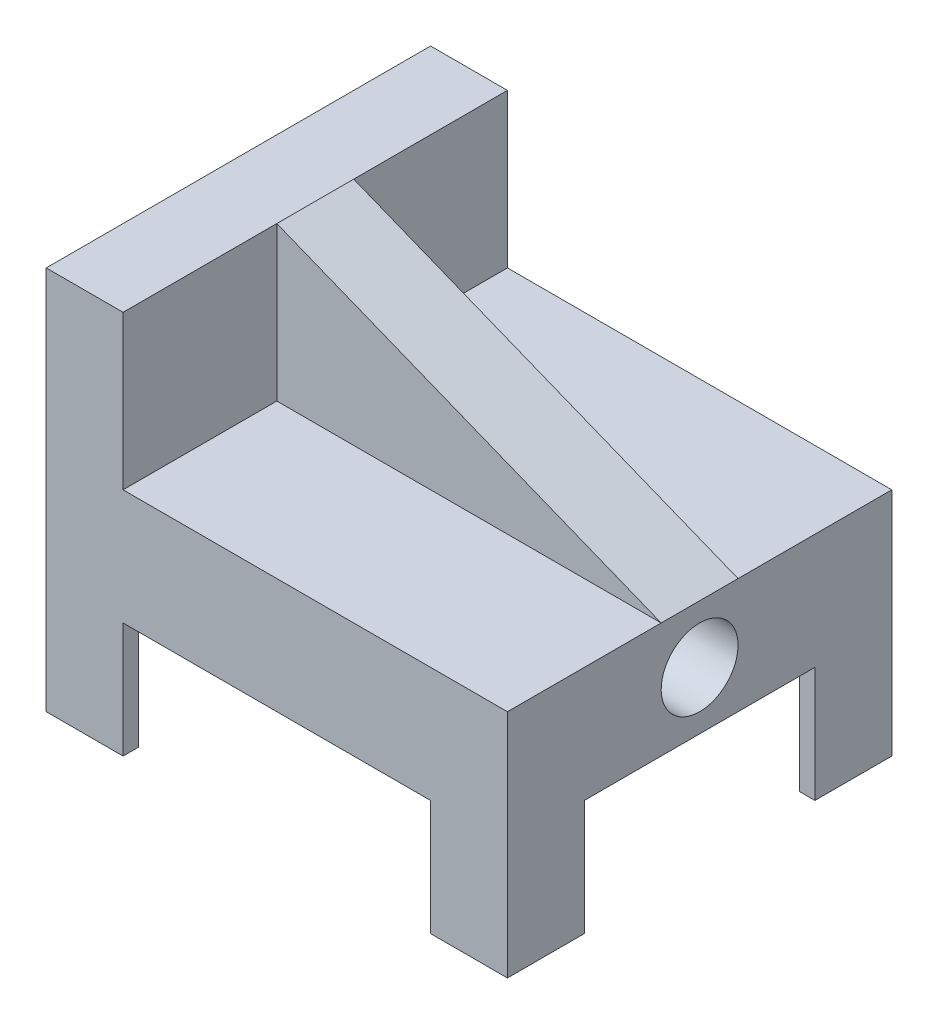
ISO-10303-21;
HEADER;
FILE_DESCRIPTION(('STEP AP214'),'2;1');
FILE_NAME('part.step','',(''),(''),'','','');
FILE_SCHEMA(('AUTOMOTIVE_DESIGN { 1 0 10303 214 1 1 1 1 }'));
ENDSEC;
DATA;
#1=APPLICATION_CONTEXT('core data for automotive mechanical design processes');
#2=APPLICATION_PROTOCOL_DEFINITION('international standard','automotive_design',2000,#1);
#3=PRODUCT_CONTEXT('',#1,'mechanical');
#4=PRODUCT('Part','Part','',(#3));
#5=PRODUCT_RELATED_PRODUCT_CATEGORY('part','',(#4));
#6=PRODUCT_DEFINITION_FORMATION('','',#4);
#7=PRODUCT_DEFINITION_CONTEXT('part definition',#1,'design');
#8=PRODUCT_DEFINITION('design','',#6,#7);
#9=PRODUCT_DEFINITION_SHAPE('','',#8);
#10=(LENGTH_UNIT() NAMED_UNIT(*) SI_UNIT(.MILLI.,.METRE.));
#11=(NAMED_UNIT(*) PLANE_ANGLE_UNIT() SI_UNIT($,.RADIAN.));
#12=(NAMED_UNIT(*) SI_UNIT($,.STERADIAN.) SOLID_ANGLE_UNIT());
#13=UNCERTAINTY_MEASURE_WITH_UNIT(LENGTH_MEASURE(1.E-05),#10,'distance_accuracy_value','');
#14=(GEOMETRIC_REPRESENTATION_CONTEXT(3) GLOBAL_UNCERTAINTY_ASSIGNED_CONTEXT((#13)) GLOBAL_UNIT_ASSIGNED_CONTEXT((#10,
#11,#12)) REPRESENTATION_CONTEXT('',''));
#15=CARTESIAN_POINT('',(0.,0.,0.));
#16=DIRECTION('',(0.,0.,1.));
#17=DIRECTION('',(1.,0.,0.));
#18=AXIS2_PLACEMENT_3D('',#15,#16,#17);
#19=CARTESIAN_POINT('',(-59.9092284417549,-20.5597579425113,-100.));
#20=DIRECTION('',(0.,-1.,0.));
#21=DIRECTION('',(0.,0.,-1.));
#22=AXIS2_PLACEMENT_3D('',#19,#20,#21);
#23=PLANE('',#22);
#24=DIRECTION('',(0.,0.,1.));
#25=VECTOR('',#24,1.);
#26=CARTESIAN_POINT('',(40.090771558245,-20.5597579425113,0.));
#27=LINE('',#26,#25);
#28=CARTESIAN_POINT('',(40.0907715582451,-20.5597579425113,-100.));
#29=VERTEX_POINT('',#28);
#30=CARTESIAN_POINT('',(40.0907715582451,-20.5597579425113,-96.));
#31=VERTEX_POINT('',#30);
#32=EDGE_CURVE('E111',#29,#31,#27,.T.);
#33=ORIENTED_EDGE('',*,*,#32,.T.);
#34=DIRECTION('',(-1.,0.,0.));
#35=VECTOR('',#34,1.);
#36=CARTESIAN_POINT('',(0.,-20.5597579425113,-96.));
#37=LINE('',#36,#35);
#38=CARTESIAN_POINT('',(56.090771558245,-20.5597579425113,-96.));
#39=VERTEX_POINT('',#38);
#40=EDGE_CURVE('E116',#39,#31,#37,.T.);
#41=ORIENTED_EDGE('',*,*,#40,.F.);
#42=DIRECTION('',(0.,0.,1.));
#43=VECTOR('',#42,1.);
#44=CARTESIAN_POINT('',(56.090771558245,-20.5597579425113,0.));
#45=LINE('',#44,#43);
#46=CARTESIAN_POINT('',(56.090771558245,-20.5597579425113,-80.));
#47=VERTEX_POINT('',#46);
#48=EDGE_CURVE('E326',#39,#47,#45,.T.);
#49=ORIENTED_EDGE('',*,*,#48,.T.);
#50=DIRECTION('',(-1.,0.,0.));
#51=VECTOR('',#50,1.);
#52=CARTESIAN_POINT('',(0.,-20.5597579425113,-80.));
#53=LINE('',#52,#51);
#54=CARTESIAN_POINT('',(60.0907715582451,-20.5597579425113,-80.));
#55=VERTEX_POINT('',#54);
#56=EDGE_CURVE('E303',#55,#47,#53,.T.);
#57=ORIENTED_EDGE('',*,*,#56,.F.);
#58=DIRECTION('',(0.,0.,1.));
#59=VECTOR('',#58,1.);
#60=CARTESIAN_POINT('',(60.0907715582451,-20.5597579425113,-100.));
#61=LINE('',#60,#59);
#62=CARTESIAN_POINT('',(60.0907715582451,-20.5597579425113,-20.));
#63=VERTEX_POINT('',#62);
#64=EDGE_CURVE('E580',#55,#63,#61,.T.);
#65=ORIENTED_EDGE('',*,*,#64,.T.);
#66=DIRECTION('',(-1.,0.,0.));
#67=VECTOR('',#66,1.);
#68=CARTESIAN_POINT('',(0.,-20.5597579425113,-20.));
#69=LINE('',#68,#67);
#70=CARTESIAN_POINT('',(56.090771558245,-20.5597579425113,-20.));
#71=VERTEX_POINT('',#70);
#72=EDGE_CURVE('E397',#63,#71,#69,.T.);
#73=ORIENTED_EDGE('',*,*,#72,.T.);
#74=DIRECTION('',(0.,0.,-1.));
#75=VECTOR('',#74,1.);
#76=CARTESIAN_POINT('',(56.090771558245,-20.5597579425113,0.));
#77=LINE('',#76,#75);
#78=CARTESIAN_POINT('',(56.090771558245,-20.5597579425113,-4.));
#79=VERTEX_POINT('',#78);
#80=EDGE_CURVE('E402',#79,#71,#77,.T.);
#81=ORIENTED_EDGE('',*,*,#80,.F.);
#82=DIRECTION('',(-1.,0.,0.));
#83=VECTOR('',#82,1.);
#84=CARTESIAN_POINT('',(0.,-20.5597579425113,-4.));
#85=LINE('',#84,#83);
#86=CARTESIAN_POINT('',(40.090771558245,-20.5597579425113,-4.));
#87=VERTEX_POINT('',#86);
#88=EDGE_CURVE('E406',#79,#87,#85,.T.);
#89=ORIENTED_EDGE('',*,*,#88,.T.);
#90=DIRECTION('',(0.,0.,-1.));
#91=VECTOR('',#90,1.);
#92=CARTESIAN_POINT('',(40.090771558245,-20.5597579425113,0.));
#93=LINE('',#92,#91);
#94=CARTESIAN_POINT('',(40.090771558245,-20.5597579425113,0.));
#95=VERTEX_POINT('',#94);
#96=EDGE_CURVE('E393',#95,#87,#93,.T.);
#97=ORIENTED_EDGE('',*,*,#96,.F.);
#98=DIRECTION('',(1.,0.,0.));
#99=VECTOR('',#98,1.);
#100=CARTESIAN_POINT('',(-59.9092284417549,-20.5597579425113,0.));
#101=LINE('',#100,#99);
#102=CARTESIAN_POINT('',(-39.9092284417549,-20.5597579425113,0.));
#103=VERTEX_POINT('',#102);
#104=EDGE_CURVE('E566',#103,#95,#101,.T.);
#105=ORIENTED_EDGE('',*,*,#104,.F.);
#106=DIRECTION('',(0.,0.,-1.));
#107=VECTOR('',#106,1.);
#108=CARTESIAN_POINT('',(-39.9092284417549,-20.5597579425113,0.));
#109=LINE('',#108,#107);
#110=CARTESIAN_POINT('',(-39.9092284417549,-20.5597579425113,-4.));
#111=VERTEX_POINT('',#110);
#112=EDGE_CURVE('E459',#103,#111,#109,.T.);
#113=ORIENTED_EDGE('',*,*,#112,.T.);
#114=DIRECTION('',(1.,0.,0.));
#115=VECTOR('',#114,1.);
#116=CARTESIAN_POINT('',(0.,-20.5597579425113,-4.));
#117=LINE('',#116,#115);
#118=CARTESIAN_POINT('',(-55.9092284417549,-20.5597579425113,-4.));
#119=VERTEX_POINT('',#118);
#120=EDGE_CURVE('E455',#119,#111,#117,.T.);
#121=ORIENTED_EDGE('',*,*,#120,.F.);
#122=DIRECTION('',(0.,0.,-1.));
#123=VECTOR('',#122,1.);
#124=CARTESIAN_POINT('',(-55.9092284417549,-20.5597579425113,0.));
#125=LINE('',#124,#123);
#126=CARTESIAN_POINT('',(-55.9092284417549,-20.5597579425113,-20.));
#127=VERTEX_POINT('',#126);
#128=EDGE_CURVE('E410',#119,#127,#125,.T.);
#129=ORIENTED_EDGE('',*,*,#128,.T.);
#130=DIRECTION('',(1.,0.,0.));
#131=VECTOR('',#130,1.);
#132=CARTESIAN_POINT('',(0.,-20.5597579425113,-20.));
#133=LINE('',#132,#131);
#134=CARTESIAN_POINT('',(-59.9092284417549,-20.5597579425113,-20.));
#135=VERTEX_POINT('',#134);
#136=EDGE_CURVE('E435',#135,#127,#133,.T.);
#137=ORIENTED_EDGE('',*,*,#136,.F.);
#138=DIRECTION('',(0.,0.,1.));
#139=VECTOR('',#138,1.);
#140=CARTESIAN_POINT('',(-59.9092284417549,-20.5597579425113,-100.));
#141=LINE('',#140,#139);
#142=CARTESIAN_POINT('',(-59.9092284417549,-20.5597579425113,-80.));
#143=VERTEX_POINT('',#142);
#144=EDGE_CURVE('E563',#143,#135,#141,.T.);
#145=ORIENTED_EDGE('',*,*,#144,.F.);
#146=DIRECTION('',(1.,0.,0.));
#147=VECTOR('',#146,1.);
#148=CARTESIAN_POINT('',(-59.9092284417549,-20.5597579425113,-80.));
#149=LINE('',#148,#147);
#150=CARTESIAN_POINT('',(-55.9092284417549,-20.5597579425113,-80.));
#151=VERTEX_POINT('',#150);
#152=EDGE_CURVE('E341',#143,#151,#149,.T.);
#153=ORIENTED_EDGE('',*,*,#152,.T.);
#154=DIRECTION('',(0.,0.,1.));
#155=VECTOR('',#154,1.);
#156=CARTESIAN_POINT('',(-55.9092284417549,-20.5597579425113,-100.));
#157=LINE('',#156,#155);
#158=CARTESIAN_POINT('',(-55.9092284417549,-20.5597579425113,-96.));
#159=VERTEX_POINT('',#158);
#160=EDGE_CURVE('E337',#159,#151,#157,.T.);
#161=ORIENTED_EDGE('',*,*,#160,.F.);
#162=DIRECTION('',(1.,0.,0.));
#163=VECTOR('',#162,1.);
#164=CARTESIAN_POINT('',(-59.9092284417549,-20.5597579425113,-96.));
#165=LINE('',#164,#163);
#166=CARTESIAN_POINT('',(-39.9092284417549,-20.5597579425113,-96.));
#167=VERTEX_POINT('',#166);
#168=EDGE_CURVE('E336',#159,#167,#165,.T.);
#169=ORIENTED_EDGE('',*,*,#168,.T.);
#170=DIRECTION('',(0.,0.,1.));
#171=VECTOR('',#170,1.);
#172=CARTESIAN_POINT('',(-39.9092284417549,-20.5597579425113,-100.));
#173=LINE('',#172,#171);
#174=CARTESIAN_POINT('',(-39.9092284417549,-20.5597579425113,-100.));
#175=VERTEX_POINT('',#174);
#176=EDGE_CURVE('E362',#175,#167,#173,.T.);
#177=ORIENTED_EDGE('',*,*,#176,.F.);
#178=DIRECTION('',(1.,0.,0.));
#179=VECTOR('',#178,1.);
#180=CARTESIAN_POINT('',(-59.9092284417549,-20.5597579425113,-100.));
#181=LINE('',#180,#179);
#182=EDGE_CURVE('E551',#175,#29,#181,.T.);
#183=ORIENTED_EDGE('',*,*,#182,.T.);
#184=EDGE_LOOP('',(#33,#41,#49,#57,#65,#73,#81,#89,#97,#105,#113,#121,#129,#137,#145,#153,#161,
#169,#177,#183));
#185=FACE_BOUND('',#184,.T.);
#186=ADVANCED_FACE('F95',(#185),#23,.T.);
#187=CARTESIAN_POINT('',(60.0907715582451,9.44024205748865,-100.));
#188=DIRECTION('',(1.,0.,0.));
#189=DIRECTION('',(0.,1.,0.));
#190=AXIS2_PLACEMENT_3D('',#187,#188,#189);
#191=PLANE('',#190);
#192=CARTESIAN_POINT('',(60.0907715582451,-5.55975794251135,-50.));
#193=DIRECTION('',(1.,0.,0.));
#194=DIRECTION('',(0.,1.,0.));
#195=AXIS2_PLACEMENT_3D('',#192,#193,#194);
#196=CIRCLE('',#195,10.);
#197=CARTESIAN_POINT('',(60.0907715582451,4.44024205748865,-50.));
#198=VERTEX_POINT('',#197);
#199=EDGE_CURVE('E484',#198,#198,#196,.T.);
#200=ORIENTED_EDGE('',*,*,#199,.F.);
#201=EDGE_LOOP('',(#200));
#202=FACE_BOUND('',#201,.T.);
#203=DIRECTION('',(0.,0.,1.));
#204=VECTOR('',#203,1.);
#205=CARTESIAN_POINT('',(60.0907715582451,9.44024205748865,-100.));
#206=LINE('',#205,#204);
#207=CARTESIAN_POINT('',(60.0907715582451,9.44024205748865,-100.));
#208=VERTEX_POINT('',#207);
#209=CARTESIAN_POINT('',(60.0907715582451,9.44024205748865,-60.));
#210=VERTEX_POINT('',#209);
#211=EDGE_CURVE('E104',#208,#210,#206,.T.);
#212=ORIENTED_EDGE('',*,*,#211,.T.);
#213=DIRECTION('',(0.,0.,-1.));
#214=VECTOR('',#213,1.);
#215=CARTESIAN_POINT('',(60.0907715582451,9.44024205748865,173.965534607796));
#216=LINE('',#215,#214);
#217=CARTESIAN_POINT('',(60.0907715582451,9.44024205748865,-40.));
#218=VERTEX_POINT('',#217);
#219=EDGE_CURVE('E496',#218,#210,#216,.T.);
#220=ORIENTED_EDGE('',*,*,#219,.F.);
#221=CARTESIAN_POINT('',(60.0907715582451,9.44024205748865,0.));
#222=VERTEX_POINT('',#221);
#223=EDGE_CURVE('E579',#218,#222,#206,.T.);
#224=ORIENTED_EDGE('',*,*,#223,.T.);
#225=DIRECTION('',(0.,1.,0.));
#226=VECTOR('',#225,1.);
#227=CARTESIAN_POINT('',(60.0907715582451,9.44024205748865,0.));
#228=LINE('',#227,#226);
#229=CARTESIAN_POINT('',(60.0907715582451,-50.5597579425113,0.));
#230=VERTEX_POINT('',#229);
#231=EDGE_CURVE('E570',#230,#222,#228,.T.);
#232=ORIENTED_EDGE('',*,*,#231,.F.);
#233=DIRECTION('',(0.,0.,1.));
#234=VECTOR('',#233,1.);
#235=CARTESIAN_POINT('',(60.0907715582451,-50.5597579425113,0.));
#236=LINE('',#235,#234);
#237=CARTESIAN_POINT('',(60.0907715582451,-50.5597579425113,-20.));
#238=VERTEX_POINT('',#237);
#239=EDGE_CURVE('E416',#238,#230,#236,.T.);
#240=ORIENTED_EDGE('',*,*,#239,.F.);
#241=DIRECTION('',(0.,1.,0.));
#242=VECTOR('',#241,1.);
#243=CARTESIAN_POINT('',(60.0907715582451,-50.5597579425113,-20.));
#244=LINE('',#243,#242);
#245=EDGE_CURVE('E382',#238,#63,#244,.T.);
#246=ORIENTED_EDGE('',*,*,#245,.T.);
#247=ORIENTED_EDGE('',*,*,#64,.F.);
#248=DIRECTION('',(0.,1.,0.));
#249=VECTOR('',#248,1.);
#250=CARTESIAN_POINT('',(60.0907715582451,-50.5597579425113,-80.));
#251=LINE('',#250,#249);
#252=CARTESIAN_POINT('',(60.0907715582451,-50.5597579425113,-80.));
#253=VERTEX_POINT('',#252);
#254=EDGE_CURVE('E307',#253,#55,#251,.T.);
#255=ORIENTED_EDGE('',*,*,#254,.F.);
#256=DIRECTION('',(0.,0.,1.));
#257=VECTOR('',#256,1.);
#258=CARTESIAN_POINT('',(60.0907715582451,-50.5597579425113,0.));
#259=LINE('',#258,#257);
#260=CARTESIAN_POINT('',(60.0907715582451,-50.5597579425113,-100.));
#261=VERTEX_POINT('',#260);
#262=EDGE_CURVE('E293',#261,#253,#259,.T.);
#263=ORIENTED_EDGE('',*,*,#262,.F.);
#264=DIRECTION('',(0.,1.,0.));
#265=VECTOR('',#264,1.);
#266=CARTESIAN_POINT('',(60.0907715582451,9.44024205748865,-100.));
#267=LINE('',#266,#265);
#268=EDGE_CURVE('E555',#261,#208,#267,.T.);
#269=ORIENTED_EDGE('',*,*,#268,.T.);
#270=EDGE_LOOP('',(#212,#220,#224,#232,#240,#246,#247,#255,#263,#269));
#271=FACE_BOUND('',#270,.T.);
#272=ADVANCED_FACE('F649',(#202,#271),#191,.T.);
#273=CARTESIAN_POINT('',(0.,49.4402420574887,0.));
#274=DIRECTION('',(0.,-1.,0.));
#275=DIRECTION('',(0.,0.,-1.));
#276=AXIS2_PLACEMENT_3D('',#273,#274,#275);
#277=PLANE('',#276);
#278=DIRECTION('',(0.,0.,-1.));
#279=VECTOR('',#278,1.);
#280=CARTESIAN_POINT('',(-39.9092284417549,49.4402420574887,173.965534607796));
#281=LINE('',#280,#279);
#282=CARTESIAN_POINT('',(-39.9092284417549,49.4402420574887,-40.));
#283=VERTEX_POINT('',#282);
#284=CARTESIAN_POINT('',(-39.9092284417549,49.4402420574887,-60.));
#285=VERTEX_POINT('',#284);
#286=EDGE_CURVE('E500',#283,#285,#281,.T.);
#287=ORIENTED_EDGE('',*,*,#286,.T.);
#288=DIRECTION('',(0.,0.,1.));
#289=VECTOR('',#288,1.);
#290=CARTESIAN_POINT('',(-39.9092284417549,49.4402420574887,-100.));
#291=LINE('',#290,#289);
#292=CARTESIAN_POINT('',(-39.9092284417549,49.4402420574887,-100.));
#293=VERTEX_POINT('',#292);
#294=EDGE_CURVE('E526',#293,#285,#291,.T.);
#295=ORIENTED_EDGE('',*,*,#294,.F.);
#296=DIRECTION('',(1.,0.,0.));
#297=VECTOR('',#296,1.);
#298=CARTESIAN_POINT('',(-59.9092284417549,49.4402420574887,-100.));
#299=LINE('',#298,#297);
#300=CARTESIAN_POINT('',(-59.9092284417549,49.4402420574887,-100.));
#301=VERTEX_POINT('',#300);
#302=EDGE_CURVE('E529',#301,#293,#299,.T.);
#303=ORIENTED_EDGE('',*,*,#302,.F.);
#304=DIRECTION('',(0.,0.,1.));
#305=VECTOR('',#304,1.);
#306=CARTESIAN_POINT('',(-59.9092284417549,49.4402420574887,-100.));
#307=LINE('',#306,#305);
#308=CARTESIAN_POINT('',(-59.9092284417549,49.4402420574887,0.));
#309=VERTEX_POINT('',#308);
#310=EDGE_CURVE('E533',#301,#309,#307,.T.);
#311=ORIENTED_EDGE('',*,*,#310,.T.);
#312=DIRECTION('',(1.,0.,0.));
#313=VECTOR('',#312,1.);
#314=CARTESIAN_POINT('',(-59.9092284417549,49.4402420574887,0.));
#315=LINE('',#314,#313);
#316=CARTESIAN_POINT('',(-39.9092284417549,49.4402420574887,0.));
#317=VERTEX_POINT('',#316);
#318=EDGE_CURVE('E520',#309,#317,#315,.T.);
#319=ORIENTED_EDGE('',*,*,#318,.T.);
#320=EDGE_CURVE('E524',#283,#317,#291,.T.);
#321=ORIENTED_EDGE('',*,*,#320,.F.);
#322=EDGE_LOOP('',(#287,#295,#303,#311,#319,#321));
#323=FACE_BOUND('',#322,.T.);
#324=ADVANCED_FACE('F604',(#323),#277,.F.);
#325=CARTESIAN_POINT('',(-39.9092284417549,49.4402420574887,-40.));
#326=DIRECTION('',(0.,0.,-1.));
#327=DIRECTION('',(-1.,0.,0.));
#328=AXIS2_PLACEMENT_3D('',#325,#326,#327);
#329=PLANE('',#328);
#330=DIRECTION('',(-0.928476690885259,0.371390676354104,0.));
#331=VECTOR('',#330,1.);
#332=CARTESIAN_POINT('',(-39.9092284417549,49.4402420574887,-40.));
#333=LINE('',#332,#331);
#334=EDGE_CURVE('E489',#218,#283,#333,.T.);
#335=ORIENTED_EDGE('',*,*,#334,.T.);
#336=DIRECTION('',(0.,-1.,0.));
#337=VECTOR('',#336,1.);
#338=CARTESIAN_POINT('',(-39.9092284417549,49.4402420574887,-40.));
#339=LINE('',#338,#337);
#340=CARTESIAN_POINT('',(-39.9092284417549,9.44024205748865,-40.));
#341=VERTEX_POINT('',#340);
#342=EDGE_CURVE('E512',#283,#341,#339,.T.);
#343=ORIENTED_EDGE('',*,*,#342,.T.);
#344=DIRECTION('',(1.,0.,0.));
#345=VECTOR('',#344,1.);
#346=CARTESIAN_POINT('',(-39.9092284417549,9.44024205748865,-40.));
#347=LINE('',#346,#345);
#348=EDGE_CURVE('E504',#341,#218,#347,.T.);
#349=ORIENTED_EDGE('',*,*,#348,.T.);
#350=EDGE_LOOP('',(#335,#343,#349));
#351=FACE_BOUND('',#350,.T.);
#352=ADVANCED_FACE('F714',(#351),#329,.F.);
#353=CARTESIAN_POINT('',(-39.9092284417549,49.4402420574887,-60.));
#354=DIRECTION('',(0.,0.,-1.));
#355=DIRECTION('',(-1.,0.,0.));
#356=AXIS2_PLACEMENT_3D('',#353,#354,#355);
#357=PLANE('',#356);
#358=DIRECTION('',(0.,-1.,0.));
#359=VECTOR('',#358,1.);
#360=CARTESIAN_POINT('',(-39.9092284417549,49.4402420574887,-60.));
#361=LINE('',#360,#359);
#362=CARTESIAN_POINT('',(-39.9092284417549,9.44024205748865,-60.));
#363=VERTEX_POINT('',#362);
#364=EDGE_CURVE('E516',#285,#363,#361,.T.);
#365=ORIENTED_EDGE('',*,*,#364,.F.);
#366=DIRECTION('',(0.928476690885259,-0.371390676354104,0.));
#367=VECTOR('',#366,1.);
#368=CARTESIAN_POINT('',(-39.9092284417549,49.4402420574887,-60.));
#369=LINE('',#368,#367);
#370=EDGE_CURVE('E12',#285,#210,#369,.T.);
#371=ORIENTED_EDGE('',*,*,#370,.T.);
#372=DIRECTION('',(1.,0.,0.));
#373=VECTOR('',#372,1.);
#374=CARTESIAN_POINT('',(-39.9092284417549,9.44024205748865,-60.));
#375=LINE('',#374,#373);
#376=EDGE_CURVE('E508',#363,#210,#375,.T.);
#377=ORIENTED_EDGE('',*,*,#376,.F.);
#378=EDGE_LOOP('',(#365,#371,#377));
#379=FACE_BOUND('',#378,.T.);
#380=ADVANCED_FACE('F717',(#379),#357,.T.);
#381=CARTESIAN_POINT('',(-59.9092284417549,9.44024205748865,-100.));
#382=DIRECTION('',(0.,1.,0.));
#383=DIRECTION('',(0.,0.,1.));
#384=AXIS2_PLACEMENT_3D('',#381,#382,#383);
#385=PLANE('',#384);
#386=ORIENTED_EDGE('',*,*,#223,.F.);
#387=ORIENTED_EDGE('',*,*,#348,.F.);
#388=DIRECTION('',(0.,0.,1.));
#389=VECTOR('',#388,1.);
#390=CARTESIAN_POINT('',(-39.9092284417549,9.44024205748865,-100.));
#391=LINE('',#390,#389);
#392=CARTESIAN_POINT('',(-39.9092284417549,9.44024205748865,0.));
#393=VERTEX_POINT('',#392);
#394=EDGE_CURVE('E519',#341,#393,#391,.T.);
#395=ORIENTED_EDGE('',*,*,#394,.T.);
#396=DIRECTION('',(-1.,0.,0.));
#397=VECTOR('',#396,1.);
#398=CARTESIAN_POINT('',(-59.9092284417549,9.44024205748865,0.));
#399=LINE('',#398,#397);
#400=EDGE_CURVE('E552',#222,#393,#399,.T.);
#401=ORIENTED_EDGE('',*,*,#400,.F.);
#402=EDGE_LOOP('',(#386,#387,#395,#401));
#403=FACE_BOUND('',#402,.T.);
#404=ADVANCED_FACE('F701',(#403),#385,.T.);
#405=CARTESIAN_POINT('',(-39.9092284417549,49.4402420574887,-100.));
#406=DIRECTION('',(1.,0.,0.));
#407=DIRECTION('',(0.,0.,-1.));
#408=AXIS2_PLACEMENT_3D('',#405,#406,#407);
#409=PLANE('',#408);
#410=ORIENTED_EDGE('',*,*,#394,.F.);
#411=ORIENTED_EDGE('',*,*,#342,.F.);
#412=ORIENTED_EDGE('',*,*,#320,.T.);
#413=DIRECTION('',(0.,-1.,0.));
#414=VECTOR('',#413,1.);
#415=CARTESIAN_POINT('',(-39.9092284417549,49.4402420574887,0.));
#416=LINE('',#415,#414);
#417=EDGE_CURVE('E543',#317,#393,#416,.T.);
#418=ORIENTED_EDGE('',*,*,#417,.T.);
#419=EDGE_LOOP('',(#410,#411,#412,#418));
#420=FACE_BOUND('',#419,.T.);
#421=ADVANCED_FACE('F612',(#420),#409,.T.);
#422=ORIENTED_EDGE('',*,*,#376,.T.);
#423=ORIENTED_EDGE('',*,*,#211,.F.);
#424=DIRECTION('',(-1.,0.,0.));
#425=VECTOR('',#424,1.);
#426=CARTESIAN_POINT('',(-59.9092284417549,9.44024205748865,-100.));
#427=LINE('',#426,#425);
#428=CARTESIAN_POINT('',(-39.9092284417549,9.44024205748865,-100.));
#429=VERTEX_POINT('',#428);
#430=EDGE_CURVE('E559',#208,#429,#427,.T.);
#431=ORIENTED_EDGE('',*,*,#430,.T.);
#432=EDGE_CURVE('E525',#429,#363,#391,.T.);
#433=ORIENTED_EDGE('',*,*,#432,.T.);
#434=EDGE_LOOP('',(#422,#423,#431,#433));
#435=FACE_BOUND('',#434,.T.);
#436=ADVANCED_FACE('F697',(#435),#385,.T.);
#437=CARTESIAN_POINT('',(-59.9092284417549,9.44024205748865,-100.));
#438=DIRECTION('',(-1.,0.,0.));
#439=DIRECTION('',(0.,0.,1.));
#440=AXIS2_PLACEMENT_3D('',#437,#438,#439);
#441=PLANE('',#440);
#442=CARTESIAN_POINT('',(-59.9092284417549,-5.55975794251129,-50.));
#443=DIRECTION('',(1.,0.,0.));
#444=DIRECTION('',(0.,1.,0.));
#445=AXIS2_PLACEMENT_3D('',#442,#443,#444);
#446=CIRCLE('',#445,10.);
#447=CARTESIAN_POINT('',(-59.9092284417549,4.44024205748871,-50.));
#448=VERTEX_POINT('',#447);
#449=EDGE_CURVE('E485',#448,#448,#446,.T.);
#450=ORIENTED_EDGE('',*,*,#449,.T.);
#451=EDGE_LOOP('',(#450));
#452=FACE_BOUND('',#451,.T.);
#453=DIRECTION('',(0.,-1.,0.));
#454=VECTOR('',#453,1.);
#455=CARTESIAN_POINT('',(-59.9092284417549,9.44024205748865,0.));
#456=LINE('',#455,#454);
#457=CARTESIAN_POINT('',(-59.9092284417549,-50.5597579425113,0.));
#458=VERTEX_POINT('',#457);
#459=EDGE_CURVE('E547',#309,#458,#456,.T.);
#460=ORIENTED_EDGE('',*,*,#459,.F.);
#461=ORIENTED_EDGE('',*,*,#310,.F.);
#462=DIRECTION('',(0.,-1.,0.));
#463=VECTOR('',#462,1.);
#464=CARTESIAN_POINT('',(-59.9092284417549,9.44024205748865,-100.));
#465=LINE('',#464,#463);
#466=CARTESIAN_POINT('',(-59.9092284417549,-50.5597579425113,-100.));
#467=VERTEX_POINT('',#466);
#468=EDGE_CURVE('E548',#301,#467,#465,.T.);
#469=ORIENTED_EDGE('',*,*,#468,.T.);
#470=DIRECTION('',(0.,0.,1.));
#471=VECTOR('',#470,1.);
#472=CARTESIAN_POINT('',(-59.9092284417549,-50.5597579425113,-100.));
#473=LINE('',#472,#471);
#474=CARTESIAN_POINT('',(-59.9092284417549,-50.5597579425113,-80.));
#475=VERTEX_POINT('',#474);
#476=EDGE_CURVE('E342',#467,#475,#473,.T.);
#477=ORIENTED_EDGE('',*,*,#476,.T.);
#478=DIRECTION('',(0.,1.,0.));
#479=VECTOR('',#478,1.);
#480=CARTESIAN_POINT('',(-59.9092284417549,-50.5597579425113,-80.));
#481=LINE('',#480,#479);
#482=EDGE_CURVE('E327',#475,#143,#481,.T.);
#483=ORIENTED_EDGE('',*,*,#482,.T.);
#484=ORIENTED_EDGE('',*,*,#144,.T.);
#485=DIRECTION('',(0.,1.,0.));
#486=VECTOR('',#485,1.);
#487=CARTESIAN_POINT('',(-59.9092284417549,-50.5597579425113,-20.));
#488=LINE('',#487,#486);
#489=CARTESIAN_POINT('',(-59.9092284417549,-50.5597579425113,-20.));
#490=VERTEX_POINT('',#489);
#491=EDGE_CURVE('E468',#490,#135,#488,.T.);
#492=ORIENTED_EDGE('',*,*,#491,.F.);
#493=DIRECTION('',(0.,0.,-1.));
#494=VECTOR('',#493,1.);
#495=CARTESIAN_POINT('',(-59.9092284417549,-50.5597579425113,0.));
#496=LINE('',#495,#494);
#497=EDGE_CURVE('E446',#458,#490,#496,.T.);
#498=ORIENTED_EDGE('',*,*,#497,.F.);
#499=EDGE_LOOP('',(#460,#461,#469,#477,#483,#484,#492,#498));
#500=FACE_BOUND('',#499,.T.);
#501=ADVANCED_FACE('F97',(#452,#500),#441,.T.);
#502=CARTESIAN_POINT('',(0.,0.,-100.));
#503=DIRECTION('',(0.,0.,1.));
#504=DIRECTION('',(1.,0.,0.));
#505=AXIS2_PLACEMENT_3D('',#502,#503,#504);
#506=PLANE('',#505);
#507=ORIENTED_EDGE('',*,*,#468,.F.);
#508=ORIENTED_EDGE('',*,*,#302,.T.);
#509=DIRECTION('',(0.,-1.,0.));
#510=VECTOR('',#509,1.);
#511=CARTESIAN_POINT('',(-39.9092284417549,49.4402420574887,-100.));
#512=LINE('',#511,#510);
#513=EDGE_CURVE('E537',#293,#429,#512,.T.);
#514=ORIENTED_EDGE('',*,*,#513,.T.);
#515=ORIENTED_EDGE('',*,*,#430,.F.);
#516=ORIENTED_EDGE('',*,*,#268,.F.);
#517=DIRECTION('',(1.,0.,0.));
#518=VECTOR('',#517,1.);
#519=CARTESIAN_POINT('',(0.,-50.5597579425113,-100.));
#520=LINE('',#519,#518);
#521=CARTESIAN_POINT('',(40.090771558245,-50.5597579425113,-100.));
#522=VERTEX_POINT('',#521);
#523=EDGE_CURVE('E625',#522,#261,#520,.T.);
#524=ORIENTED_EDGE('',*,*,#523,.F.);
#525=DIRECTION('',(0.,1.,0.));
#526=VECTOR('',#525,1.);
#527=CARTESIAN_POINT('',(40.090771558245,-50.5597579425113,-100.));
#528=LINE('',#527,#526);
#529=EDGE_CURVE('E635',#522,#29,#528,.T.);
#530=ORIENTED_EDGE('',*,*,#529,.T.);
#531=ORIENTED_EDGE('',*,*,#182,.F.);
#532=DIRECTION('',(0.,1.,0.));
#533=VECTOR('',#532,1.);
#534=CARTESIAN_POINT('',(-39.9092284417549,-50.5597579425113,-100.));
#535=LINE('',#534,#533);
#536=CARTESIAN_POINT('',(-39.9092284417549,-50.5597579425113,-100.));
#537=VERTEX_POINT('',#536);
#538=EDGE_CURVE('E325',#537,#175,#535,.T.);
#539=ORIENTED_EDGE('',*,*,#538,.F.);
#540=DIRECTION('',(1.,0.,0.));
#541=VECTOR('',#540,1.);
#542=CARTESIAN_POINT('',(-59.9092284417549,-50.5597579425113,-100.));
#543=LINE('',#542,#541);
#544=EDGE_CURVE('E358',#467,#537,#543,.T.);
#545=ORIENTED_EDGE('',*,*,#544,.F.);
#546=EDGE_LOOP('',(#507,#508,#514,#515,#516,#524,#530,#531,#539,#545));
#547=FACE_BOUND('',#546,.T.);
#548=ADVANCED_FACE('F705',(#547),#506,.F.);
#549=CARTESIAN_POINT('',(0.,0.,0.));
#550=DIRECTION('',(0.,0.,1.));
#551=DIRECTION('',(1.,0.,0.));
#552=AXIS2_PLACEMENT_3D('',#549,#550,#551);
#553=PLANE('',#552);
#554=ORIENTED_EDGE('',*,*,#459,.T.);
#555=DIRECTION('',(-1.,0.,0.));
#556=VECTOR('',#555,1.);
#557=CARTESIAN_POINT('',(0.,-50.5597579425113,0.));
#558=LINE('',#557,#556);
#559=CARTESIAN_POINT('',(-39.9092284417549,-50.5597579425113,0.));
#560=VERTEX_POINT('',#559);
#561=EDGE_CURVE('E442',#560,#458,#558,.T.);
#562=ORIENTED_EDGE('',*,*,#561,.F.);
#563=DIRECTION('',(0.,1.,0.));
#564=VECTOR('',#563,1.);
#565=CARTESIAN_POINT('',(-39.9092284417549,-50.5597579425113,0.));
#566=LINE('',#565,#564);
#567=EDGE_CURVE('E472',#560,#103,#566,.T.);
#568=ORIENTED_EDGE('',*,*,#567,.T.);
#569=ORIENTED_EDGE('',*,*,#104,.T.);
#570=DIRECTION('',(0.,1.,0.));
#571=VECTOR('',#570,1.);
#572=CARTESIAN_POINT('',(40.090771558245,-50.5597579425113,0.));
#573=LINE('',#572,#571);
#574=CARTESIAN_POINT('',(40.090771558245,-50.5597579425113,0.));
#575=VERTEX_POINT('',#574);
#576=EDGE_CURVE('E386',#575,#95,#573,.T.);
#577=ORIENTED_EDGE('',*,*,#576,.F.);
#578=DIRECTION('',(-1.,0.,0.));
#579=VECTOR('',#578,1.);
#580=CARTESIAN_POINT('',(0.,-50.5597579425113,0.));
#581=LINE('',#580,#579);
#582=EDGE_CURVE('E413',#230,#575,#581,.T.);
#583=ORIENTED_EDGE('',*,*,#582,.F.);
#584=ORIENTED_EDGE('',*,*,#231,.T.);
#585=ORIENTED_EDGE('',*,*,#400,.T.);
#586=ORIENTED_EDGE('',*,*,#417,.F.);
#587=ORIENTED_EDGE('',*,*,#318,.F.);
#588=EDGE_LOOP('',(#554,#562,#568,#569,#577,#583,#584,#585,#586,#587));
#589=FACE_BOUND('',#588,.T.);
#590=ADVANCED_FACE('F608',(#589),#553,.T.);
#591=ORIENTED_EDGE('',*,*,#364,.T.);
#592=ORIENTED_EDGE('',*,*,#432,.F.);
#593=ORIENTED_EDGE('',*,*,#513,.F.);
#594=ORIENTED_EDGE('',*,*,#294,.T.);
#595=EDGE_LOOP('',(#591,#592,#593,#594));
#596=FACE_BOUND('',#595,.T.);
#597=ADVANCED_FACE('F704',(#596),#409,.T.);
#598=CARTESIAN_POINT('',(-39.9092284417549,49.4402420574887,173.965534607796));
#599=DIRECTION('',(0.371390676354104,0.928476690885259,0.));
#600=DIRECTION('',(-0.928476690885259,0.371390676354104,0.));
#601=AXIS2_PLACEMENT_3D('',#598,#599,#600);
#602=PLANE('',#601);
#603=ORIENTED_EDGE('',*,*,#370,.F.);
#604=ORIENTED_EDGE('',*,*,#286,.F.);
#605=ORIENTED_EDGE('',*,*,#334,.F.);
#606=ORIENTED_EDGE('',*,*,#219,.T.);
#607=EDGE_LOOP('',(#603,#604,#605,#606));
#608=FACE_BOUND('',#607,.T.);
#609=ADVANCED_FACE('F687',(#608),#602,.T.);
#610=CARTESIAN_POINT('',(-59.9092284417549,-5.55975794251129,-50.));
#611=DIRECTION('',(1.,0.,0.));
#612=DIRECTION('',(0.,1.,0.));
#613=AXIS2_PLACEMENT_3D('',#610,#611,#612);
#614=CYLINDRICAL_SURFACE('',#613,10.);
#615=ORIENTED_EDGE('',*,*,#449,.F.);
#616=EDGE_LOOP('',(#615));
#617=FACE_BOUND('',#616,.T.);
#618=ORIENTED_EDGE('',*,*,#199,.T.);
#619=EDGE_LOOP('',(#618));
#620=FACE_BOUND('',#619,.T.);
#621=ADVANCED_FACE('F680',(#617,#620),#614,.F.);
#622=CARTESIAN_POINT('',(-55.9092284417549,-50.5597579425113,0.));
#623=DIRECTION('',(1.,0.,0.));
#624=DIRECTION('',(0.,0.,-1.));
#625=AXIS2_PLACEMENT_3D('',#622,#623,#624);
#626=PLANE('',#625);
#627=ORIENTED_EDGE('',*,*,#128,.F.);
#628=DIRECTION('',(0.,1.,0.));
#629=VECTOR('',#628,1.);
#630=CARTESIAN_POINT('',(-55.9092284417549,-50.5597579425113,-4.));
#631=LINE('',#630,#629);
#632=CARTESIAN_POINT('',(-55.9092284417549,-50.5597579425113,-4.));
#633=VERTEX_POINT('',#632);
#634=EDGE_CURVE('E480',#633,#119,#631,.T.);
#635=ORIENTED_EDGE('',*,*,#634,.F.);
#636=DIRECTION('',(0.,0.,-1.));
#637=VECTOR('',#636,1.);
#638=CARTESIAN_POINT('',(-55.9092284417549,-50.5597579425113,0.));
#639=LINE('',#638,#637);
#640=CARTESIAN_POINT('',(-55.9092284417549,-50.5597579425113,-20.));
#641=VERTEX_POINT('',#640);
#642=EDGE_CURVE('E430',#633,#641,#639,.T.);
#643=ORIENTED_EDGE('',*,*,#642,.T.);
#644=DIRECTION('',(0.,1.,0.));
#645=VECTOR('',#644,1.);
#646=CARTESIAN_POINT('',(-55.9092284417549,-50.5597579425113,-20.));
#647=LINE('',#646,#645);
#648=EDGE_CURVE('E452',#641,#127,#647,.T.);
#649=ORIENTED_EDGE('',*,*,#648,.T.);
#650=EDGE_LOOP('',(#627,#635,#643,#649));
#651=FACE_BOUND('',#650,.T.);
#652=ADVANCED_FACE('F678',(#651),#626,.T.);
#653=CARTESIAN_POINT('',(0.,-50.5597579425113,-4.));
#654=DIRECTION('',(0.,0.,1.));
#655=DIRECTION('',(1.,0.,0.));
#656=AXIS2_PLACEMENT_3D('',#653,#654,#655);
#657=PLANE('',#656);
#658=ORIENTED_EDGE('',*,*,#120,.T.);
#659=DIRECTION('',(0.,1.,0.));
#660=VECTOR('',#659,1.);
#661=CARTESIAN_POINT('',(-39.9092284417549,-50.5597579425113,-4.));
#662=LINE('',#661,#660);
#663=CARTESIAN_POINT('',(-39.9092284417549,-50.5597579425113,-4.));
#664=VERTEX_POINT('',#663);
#665=EDGE_CURVE('E476',#664,#111,#662,.T.);
#666=ORIENTED_EDGE('',*,*,#665,.F.);
#667=DIRECTION('',(1.,0.,0.));
#668=VECTOR('',#667,1.);
#669=CARTESIAN_POINT('',(0.,-50.5597579425113,-4.));
#670=LINE('',#669,#668);
#671=EDGE_CURVE('E434',#633,#664,#670,.T.);
#672=ORIENTED_EDGE('',*,*,#671,.F.);
#673=ORIENTED_EDGE('',*,*,#634,.T.);
#674=EDGE_LOOP('',(#658,#666,#672,#673));
#675=FACE_BOUND('',#674,.T.);
#676=ADVANCED_FACE('F676',(#675),#657,.F.);
#677=CARTESIAN_POINT('',(-39.9092284417549,-50.5597579425113,0.));
#678=DIRECTION('',(1.,0.,0.));
#679=DIRECTION('',(0.,0.,-1.));
#680=AXIS2_PLACEMENT_3D('',#677,#678,#679);
#681=PLANE('',#680);
#682=ORIENTED_EDGE('',*,*,#112,.F.);
#683=ORIENTED_EDGE('',*,*,#567,.F.);
#684=DIRECTION('',(0.,0.,-1.));
#685=VECTOR('',#684,1.);
#686=CARTESIAN_POINT('',(-39.9092284417549,-50.5597579425113,0.));
#687=LINE('',#686,#685);
#688=EDGE_CURVE('E438',#560,#664,#687,.T.);
#689=ORIENTED_EDGE('',*,*,#688,.T.);
#690=ORIENTED_EDGE('',*,*,#665,.T.);
#691=EDGE_LOOP('',(#682,#683,#689,#690));
#692=FACE_BOUND('',#691,.T.);
#693=ADVANCED_FACE('F672',(#692),#681,.T.);
#694=CARTESIAN_POINT('',(0.,-50.5597579425113,-20.));
#695=DIRECTION('',(0.,0.,1.));
#696=DIRECTION('',(1.,0.,0.));
#697=AXIS2_PLACEMENT_3D('',#694,#695,#696);
#698=PLANE('',#697);
#699=ORIENTED_EDGE('',*,*,#136,.T.);
#700=ORIENTED_EDGE('',*,*,#648,.F.);
#701=DIRECTION('',(1.,0.,0.));
#702=VECTOR('',#701,1.);
#703=CARTESIAN_POINT('',(0.,-50.5597579425113,-20.));
#704=LINE('',#703,#702);
#705=EDGE_CURVE('E449',#490,#641,#704,.T.);
#706=ORIENTED_EDGE('',*,*,#705,.F.);
#707=ORIENTED_EDGE('',*,*,#491,.T.);
#708=EDGE_LOOP('',(#699,#700,#706,#707));
#709=FACE_BOUND('',#708,.T.);
#710=ADVANCED_FACE('F593',(#709),#698,.F.);
#711=CARTESIAN_POINT('',(0.,-50.5597579425113,0.));
#712=DIRECTION('',(0.,-1.,0.));
#713=DIRECTION('',(0.,0.,-1.));
#714=AXIS2_PLACEMENT_3D('',#711,#712,#713);
#715=PLANE('',#714);
#716=ORIENTED_EDGE('',*,*,#642,.F.);
#717=ORIENTED_EDGE('',*,*,#671,.T.);
#718=ORIENTED_EDGE('',*,*,#688,.F.);
#719=ORIENTED_EDGE('',*,*,#561,.T.);
#720=ORIENTED_EDGE('',*,*,#497,.T.);
#721=ORIENTED_EDGE('',*,*,#705,.T.);
#722=EDGE_LOOP('',(#716,#717,#718,#719,#720,#721));
#723=FACE_BOUND('',#722,.T.);
#724=ADVANCED_FACE('F596',(#723),#715,.T.);
#725=CARTESIAN_POINT('',(0.,-50.5597579425113,-4.));
#726=DIRECTION('',(0.,0.,-1.));
#727=DIRECTION('',(-1.,0.,0.));
#728=AXIS2_PLACEMENT_3D('',#725,#726,#727);
#729=PLANE('',#728);
#730=ORIENTED_EDGE('',*,*,#88,.F.);
#731=DIRECTION('',(0.,1.,0.));
#732=VECTOR('',#731,1.);
#733=CARTESIAN_POINT('',(56.090771558245,-50.5597579425113,-4.));
#734=LINE('',#733,#732);
#735=CARTESIAN_POINT('',(56.090771558245,-50.5597579425113,-4.));
#736=VERTEX_POINT('',#735);
#737=EDGE_CURVE('E345',#736,#79,#734,.T.);
#738=ORIENTED_EDGE('',*,*,#737,.F.);
#739=DIRECTION('',(-1.,0.,0.));
#740=VECTOR('',#739,1.);
#741=CARTESIAN_POINT('',(0.,-50.5597579425113,-4.));
#742=LINE('',#741,#740);
#743=CARTESIAN_POINT('',(40.090771558245,-50.5597579425113,-4.));
#744=VERTEX_POINT('',#743);
#745=EDGE_CURVE('E398',#736,#744,#742,.T.);
#746=ORIENTED_EDGE('',*,*,#745,.T.);
#747=DIRECTION('',(0.,1.,0.));
#748=VECTOR('',#747,1.);
#749=CARTESIAN_POINT('',(40.090771558245,-50.5597579425113,-4.));
#750=LINE('',#749,#748);
#751=EDGE_CURVE('E389',#744,#87,#750,.T.);
#752=ORIENTED_EDGE('',*,*,#751,.T.);
#753=EDGE_LOOP('',(#730,#738,#746,#752));
#754=FACE_BOUND('',#753,.T.);
#755=ADVANCED_FACE('F663',(#754),#729,.T.);
#756=CARTESIAN_POINT('',(56.090771558245,-50.5597579425113,0.));
#757=DIRECTION('',(1.,0.,0.));
#758=DIRECTION('',(0.,0.,-1.));
#759=AXIS2_PLACEMENT_3D('',#756,#757,#758);
#760=PLANE('',#759);
#761=ORIENTED_EDGE('',*,*,#80,.T.);
#762=DIRECTION('',(0.,1.,0.));
#763=VECTOR('',#762,1.);
#764=CARTESIAN_POINT('',(56.090771558245,-50.5597579425113,-20.));
#765=LINE('',#764,#763);
#766=CARTESIAN_POINT('',(56.090771558245,-50.5597579425113,-20.));
#767=VERTEX_POINT('',#766);
#768=EDGE_CURVE('E379',#767,#71,#765,.T.);
#769=ORIENTED_EDGE('',*,*,#768,.F.);
#770=DIRECTION('',(0.,0.,-1.));
#771=VECTOR('',#770,1.);
#772=CARTESIAN_POINT('',(56.090771558245,-50.5597579425113,0.));
#773=LINE('',#772,#771);
#774=EDGE_CURVE('E424',#736,#767,#773,.T.);
#775=ORIENTED_EDGE('',*,*,#774,.F.);
#776=ORIENTED_EDGE('',*,*,#737,.T.);
#777=EDGE_LOOP('',(#761,#769,#775,#776));
#778=FACE_BOUND('',#777,.T.);
#779=ADVANCED_FACE('F659',(#778),#760,.F.);
#780=CARTESIAN_POINT('',(0.,-50.5597579425113,-20.));
#781=DIRECTION('',(0.,0.,-1.));
#782=DIRECTION('',(-1.,0.,0.));
#783=AXIS2_PLACEMENT_3D('',#780,#781,#782);
#784=PLANE('',#783);
#785=ORIENTED_EDGE('',*,*,#72,.F.);
#786=ORIENTED_EDGE('',*,*,#245,.F.);
#787=DIRECTION('',(-1.,0.,0.));
#788=VECTOR('',#787,1.);
#789=CARTESIAN_POINT('',(0.,-50.5597579425113,-20.));
#790=LINE('',#789,#788);
#791=EDGE_CURVE('E420',#238,#767,#790,.T.);
#792=ORIENTED_EDGE('',*,*,#791,.T.);
#793=ORIENTED_EDGE('',*,*,#768,.T.);
#794=EDGE_LOOP('',(#785,#786,#792,#793));
#795=FACE_BOUND('',#794,.T.);
#796=ADVANCED_FACE('F654',(#795),#784,.T.);
#797=CARTESIAN_POINT('',(40.090771558245,-50.5597579425113,0.));
#798=DIRECTION('',(1.,0.,0.));
#799=DIRECTION('',(0.,0.,-1.));
#800=AXIS2_PLACEMENT_3D('',#797,#798,#799);
#801=PLANE('',#800);
#802=ORIENTED_EDGE('',*,*,#96,.T.);
#803=ORIENTED_EDGE('',*,*,#751,.F.);
#804=DIRECTION('',(0.,0.,-1.));
#805=VECTOR('',#804,1.);
#806=CARTESIAN_POINT('',(40.090771558245,-50.5597579425113,0.));
#807=LINE('',#806,#805);
#808=EDGE_CURVE('E392',#575,#744,#807,.T.);
#809=ORIENTED_EDGE('',*,*,#808,.F.);
#810=ORIENTED_EDGE('',*,*,#576,.T.);
#811=EDGE_LOOP('',(#802,#803,#809,#810));
#812=FACE_BOUND('',#811,.T.);
#813=ADVANCED_FACE('F764',(#812),#801,.F.);
#814=CARTESIAN_POINT('',(0.,-50.5597579425113,0.));
#815=DIRECTION('',(0.,-1.,0.));
#816=DIRECTION('',(0.,0.,-1.));
#817=AXIS2_PLACEMENT_3D('',#814,#815,#816);
#818=PLANE('',#817);
#819=ORIENTED_EDGE('',*,*,#745,.F.);
#820=ORIENTED_EDGE('',*,*,#774,.T.);
#821=ORIENTED_EDGE('',*,*,#791,.F.);
#822=ORIENTED_EDGE('',*,*,#239,.T.);
#823=ORIENTED_EDGE('',*,*,#582,.T.);
#824=ORIENTED_EDGE('',*,*,#808,.T.);
#825=EDGE_LOOP('',(#819,#820,#821,#822,#823,#824));
#826=FACE_BOUND('',#825,.T.);
#827=ADVANCED_FACE('F756',(#826),#818,.T.);
#828=CARTESIAN_POINT('',(0.,-50.5597579425113,0.));
#829=DIRECTION('',(0.,1.,0.));
#830=DIRECTION('',(0.,0.,1.));
#831=AXIS2_PLACEMENT_3D('',#828,#829,#830);
#832=PLANE('',#831);
#833=ORIENTED_EDGE('',*,*,#476,.F.);
#834=ORIENTED_EDGE('',*,*,#544,.T.);
#835=DIRECTION('',(0.,0.,1.));
#836=VECTOR('',#835,1.);
#837=CARTESIAN_POINT('',(-39.9092284417549,-50.5597579425113,-100.));
#838=LINE('',#837,#836);
#839=CARTESIAN_POINT('',(-39.9092284417549,-50.5597579425113,-96.));
#840=VERTEX_POINT('',#839);
#841=EDGE_CURVE('E371',#537,#840,#838,.T.);
#842=ORIENTED_EDGE('',*,*,#841,.T.);
#843=DIRECTION('',(1.,0.,0.));
#844=VECTOR('',#843,1.);
#845=CARTESIAN_POINT('',(-59.9092284417549,-50.5597579425113,-96.));
#846=LINE('',#845,#844);
#847=CARTESIAN_POINT('',(-55.9092284417549,-50.5597579425113,-96.));
#848=VERTEX_POINT('',#847);
#849=EDGE_CURVE('E366',#848,#840,#846,.T.);
#850=ORIENTED_EDGE('',*,*,#849,.F.);
#851=DIRECTION('',(0.,0.,1.));
#852=VECTOR('',#851,1.);
#853=CARTESIAN_POINT('',(-55.9092284417549,-50.5597579425113,-100.));
#854=LINE('',#853,#852);
#855=CARTESIAN_POINT('',(-55.9092284417549,-50.5597579425113,-80.));
#856=VERTEX_POINT('',#855);
#857=EDGE_CURVE('E331',#848,#856,#854,.T.);
#858=ORIENTED_EDGE('',*,*,#857,.T.);
#859=DIRECTION('',(1.,0.,0.));
#860=VECTOR('',#859,1.);
#861=CARTESIAN_POINT('',(-59.9092284417549,-50.5597579425113,-80.));
#862=LINE('',#861,#860);
#863=EDGE_CURVE('E348',#475,#856,#862,.T.);
#864=ORIENTED_EDGE('',*,*,#863,.F.);
#865=EDGE_LOOP('',(#833,#834,#842,#850,#858,#864));
#866=FACE_BOUND('',#865,.T.);
#867=ADVANCED_FACE('F739',(#866),#832,.F.);
#868=CARTESIAN_POINT('',(-39.9092284417549,-50.5597579425113,-100.));
#869=DIRECTION('',(-1.,0.,0.));
#870=DIRECTION('',(0.,0.,1.));
#871=AXIS2_PLACEMENT_3D('',#868,#869,#870);
#872=PLANE('',#871);
#873=ORIENTED_EDGE('',*,*,#176,.T.);
#874=DIRECTION('',(0.,1.,0.));
#875=VECTOR('',#874,1.);
#876=CARTESIAN_POINT('',(-39.9092284417549,-50.5597579425113,-96.));
#877=LINE('',#876,#875);
#878=EDGE_CURVE('E354',#840,#167,#877,.T.);
#879=ORIENTED_EDGE('',*,*,#878,.F.);
#880=ORIENTED_EDGE('',*,*,#841,.F.);
#881=ORIENTED_EDGE('',*,*,#538,.T.);
#882=EDGE_LOOP('',(#873,#879,#880,#881));
#883=FACE_BOUND('',#882,.T.);
#884=ADVANCED_FACE('F753',(#883),#872,.F.);
#885=CARTESIAN_POINT('',(-59.9092284417549,-50.5597579425113,-96.));
#886=DIRECTION('',(0.,0.,1.));
#887=DIRECTION('',(1.,0.,0.));
#888=AXIS2_PLACEMENT_3D('',#885,#886,#887);
#889=PLANE('',#888);
#890=ORIENTED_EDGE('',*,*,#168,.F.);
#891=DIRECTION('',(0.,-1.,0.));
#892=VECTOR('',#891,1.);
#893=CARTESIAN_POINT('',(-55.9092284417549,-50.5597579425113,-96.));
#894=LINE('',#893,#892);
#895=EDGE_CURVE('E322',#159,#848,#894,.T.);
#896=ORIENTED_EDGE('',*,*,#895,.T.);
#897=ORIENTED_EDGE('',*,*,#849,.T.);
#898=ORIENTED_EDGE('',*,*,#878,.T.);
#899=EDGE_LOOP('',(#890,#896,#897,#898));
#900=FACE_BOUND('',#899,.T.);
#901=ADVANCED_FACE('F750',(#900),#889,.T.);
#902=CARTESIAN_POINT('',(-59.9092284417549,-50.5597579425113,-80.));
#903=DIRECTION('',(0.,0.,1.));
#904=DIRECTION('',(1.,0.,0.));
#905=AXIS2_PLACEMENT_3D('',#902,#903,#904);
#906=PLANE('',#905);
#907=ORIENTED_EDGE('',*,*,#152,.F.);
#908=ORIENTED_EDGE('',*,*,#482,.F.);
#909=ORIENTED_EDGE('',*,*,#863,.T.);
#910=DIRECTION('',(0.,1.,0.));
#911=VECTOR('',#910,1.);
#912=CARTESIAN_POINT('',(-55.9092284417549,-50.5597579425113,-80.));
#913=LINE('',#912,#911);
#914=EDGE_CURVE('E332',#856,#151,#913,.T.);
#915=ORIENTED_EDGE('',*,*,#914,.T.);
#916=EDGE_LOOP('',(#907,#908,#909,#915));
#917=FACE_BOUND('',#916,.T.);
#918=ADVANCED_FACE('F738',(#917),#906,.T.);
#919=CARTESIAN_POINT('',(-55.9092284417549,-50.5597579425113,-100.));
#920=DIRECTION('',(-1.,0.,0.));
#921=DIRECTION('',(0.,0.,1.));
#922=AXIS2_PLACEMENT_3D('',#919,#920,#921);
#923=PLANE('',#922);
#924=ORIENTED_EDGE('',*,*,#895,.F.);
#925=ORIENTED_EDGE('',*,*,#160,.T.);
#926=ORIENTED_EDGE('',*,*,#914,.F.);
#927=ORIENTED_EDGE('',*,*,#857,.F.);
#928=EDGE_LOOP('',(#924,#925,#926,#927));
#929=FACE_BOUND('',#928,.T.);
#930=ADVANCED_FACE('F745',(#929),#923,.F.);
#931=CARTESIAN_POINT('',(0.,-50.5597579425113,-96.));
#932=DIRECTION('',(0.,0.,-1.));
#933=DIRECTION('',(-1.,0.,0.));
#934=AXIS2_PLACEMENT_3D('',#931,#932,#933);
#935=PLANE('',#934);
#936=ORIENTED_EDGE('',*,*,#40,.T.);
#937=DIRECTION('',(0.,1.,0.));
#938=VECTOR('',#937,1.);
#939=CARTESIAN_POINT('',(40.090771558245,-50.5597579425113,-96.));
#940=LINE('',#939,#938);
#941=CARTESIAN_POINT('',(40.090771558245,-50.5597579425113,-96.));
#942=VERTEX_POINT('',#941);
#943=EDGE_CURVE('E633',#942,#31,#940,.T.);
#944=ORIENTED_EDGE('',*,*,#943,.F.);
#945=DIRECTION('',(-1.,0.,0.));
#946=VECTOR('',#945,1.);
#947=CARTESIAN_POINT('',(0.,-50.5597579425113,-96.));
#948=LINE('',#947,#946);
#949=CARTESIAN_POINT('',(56.090771558245,-50.5597579425113,-96.));
#950=VERTEX_POINT('',#949);
#951=EDGE_CURVE('E313',#950,#942,#948,.T.);
#952=ORIENTED_EDGE('',*,*,#951,.F.);
#953=DIRECTION('',(0.,1.,0.));
#954=VECTOR('',#953,1.);
#955=CARTESIAN_POINT('',(56.090771558245,-50.5597579425113,-96.));
#956=LINE('',#955,#954);
#957=EDGE_CURVE('E310',#950,#39,#956,.T.);
#958=ORIENTED_EDGE('',*,*,#957,.T.);
#959=EDGE_LOOP('',(#936,#944,#952,#958));
#960=FACE_BOUND('',#959,.T.);
#961=ADVANCED_FACE('F638',(#960),#935,.F.);
#962=CARTESIAN_POINT('',(40.090771558245,-50.5597579425113,0.));
#963=DIRECTION('',(-1.,0.,0.));
#964=DIRECTION('',(0.,0.,1.));
#965=AXIS2_PLACEMENT_3D('',#962,#963,#964);
#966=PLANE('',#965);
#967=ORIENTED_EDGE('',*,*,#32,.F.);
#968=ORIENTED_EDGE('',*,*,#529,.F.);
#969=DIRECTION('',(0.,0.,1.));
#970=VECTOR('',#969,1.);
#971=CARTESIAN_POINT('',(40.090771558245,-50.5597579425113,0.));
#972=LINE('',#971,#970);
#973=EDGE_CURVE('E318',#522,#942,#972,.T.);
#974=ORIENTED_EDGE('',*,*,#973,.T.);
#975=ORIENTED_EDGE('',*,*,#943,.T.);
#976=EDGE_LOOP('',(#967,#968,#974,#975));
#977=FACE_BOUND('',#976,.T.);
#978=ADVANCED_FACE('F631',(#977),#966,.T.);
#979=CARTESIAN_POINT('',(0.,-50.5597579425113,0.));
#980=DIRECTION('',(0.,-1.,0.));
#981=DIRECTION('',(0.,0.,-1.));
#982=AXIS2_PLACEMENT_3D('',#979,#980,#981);
#983=PLANE('',#982);
#984=ORIENTED_EDGE('',*,*,#523,.T.);
#985=ORIENTED_EDGE('',*,*,#262,.T.);
#986=DIRECTION('',(-1.,0.,0.));
#987=VECTOR('',#986,1.);
#988=CARTESIAN_POINT('',(0.,-50.5597579425113,-80.));
#989=LINE('',#988,#987);
#990=CARTESIAN_POINT('',(56.090771558245,-50.5597579425113,-80.));
#991=VERTEX_POINT('',#990);
#992=EDGE_CURVE('E286',#253,#991,#989,.T.);
#993=ORIENTED_EDGE('',*,*,#992,.T.);
#994=DIRECTION('',(0.,0.,1.));
#995=VECTOR('',#994,1.);
#996=CARTESIAN_POINT('',(56.090771558245,-50.5597579425113,0.));
#997=LINE('',#996,#995);
#998=EDGE_CURVE('E291',#950,#991,#997,.T.);
#999=ORIENTED_EDGE('',*,*,#998,.F.);
#1000=ORIENTED_EDGE('',*,*,#951,.T.);
#1001=ORIENTED_EDGE('',*,*,#973,.F.);
#1002=EDGE_LOOP('',(#984,#985,#993,#999,#1000,#1001));
#1003=FACE_BOUND('',#1002,.T.);
#1004=ADVANCED_FACE('F289',(#1003),#983,.T.);
#1005=CARTESIAN_POINT('',(0.,-50.5597579425113,-80.));
#1006=DIRECTION('',(0.,0.,-1.));
#1007=DIRECTION('',(-1.,0.,0.));
#1008=AXIS2_PLACEMENT_3D('',#1005,#1006,#1007);
#1009=PLANE('',#1008);
#1010=ORIENTED_EDGE('',*,*,#56,.T.);
#1011=DIRECTION('',(0.,1.,0.));
#1012=VECTOR('',#1011,1.);
#1013=CARTESIAN_POINT('',(56.090771558245,-50.5597579425113,-80.));
#1014=LINE('',#1013,#1012);
#1015=EDGE_CURVE('E298',#991,#47,#1014,.T.);
#1016=ORIENTED_EDGE('',*,*,#1015,.F.);
#1017=ORIENTED_EDGE('',*,*,#992,.F.);
#1018=ORIENTED_EDGE('',*,*,#254,.T.);
#1019=EDGE_LOOP('',(#1010,#1016,#1017,#1018));
#1020=FACE_BOUND('',#1019,.T.);
#1021=ADVANCED_FACE('F302',(#1020),#1009,.F.);
#1022=CARTESIAN_POINT('',(56.090771558245,-50.5597579425113,0.));
#1023=DIRECTION('',(-1.,0.,0.));
#1024=DIRECTION('',(0.,0.,1.));
#1025=AXIS2_PLACEMENT_3D('',#1022,#1023,#1024);
#1026=PLANE('',#1025);
#1027=ORIENTED_EDGE('',*,*,#48,.F.);
#1028=ORIENTED_EDGE('',*,*,#957,.F.);
#1029=ORIENTED_EDGE('',*,*,#998,.T.);
#1030=ORIENTED_EDGE('',*,*,#1015,.T.);
#1031=EDGE_LOOP('',(#1027,#1028,#1029,#1030));
#1032=FACE_BOUND('',#1031,.T.);
#1033=ADVANCED_FACE('F309',(#1032),#1026,.T.);
#1034=CLOSED_SHELL('',(#186,#272,#324,#352,#380,#404,#421,#436,#501,#548,#590,#597,#609,#621,
#652,#676,#693,#710,#724,#755,#779,#796,#813,#827,#867,#884,#901,#918,#930,#961,#978,#1004,
#1021,#1033));
#1035=MANIFOLD_SOLID_BREP('B2',#1034);
#1036=ADVANCED_BREP_SHAPE_REPRESENTATION('',(#18,#1035),#14);
#1037=SHAPE_DEFINITION_REPRESENTATION(#9,#1036);
ENDSEC;
END-ISO-10303-21;
